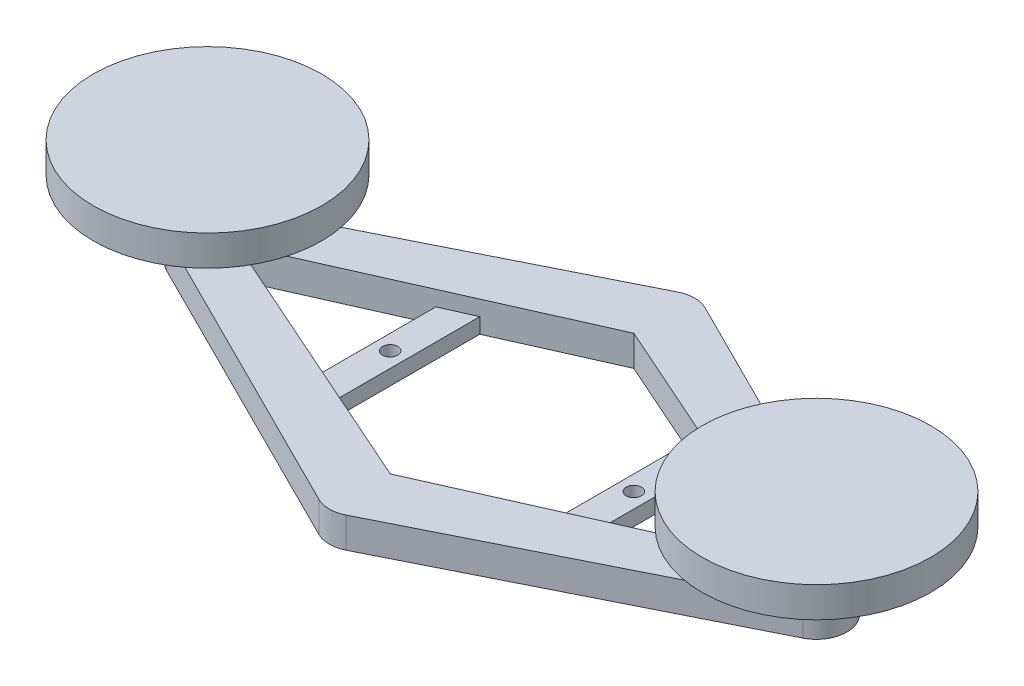
ISO-10303-21;
HEADER;
FILE_DESCRIPTION(('STEP AP214'),'2;1');
FILE_NAME('part.step','',(''),(''),'','','');
FILE_SCHEMA(('AUTOMOTIVE_DESIGN { 1 0 10303 214 1 1 1 1 }'));
ENDSEC;
DATA;
#1=APPLICATION_CONTEXT('core data for automotive mechanical design processes');
#2=APPLICATION_PROTOCOL_DEFINITION('international standard','automotive_design',2000,#1);
#3=PRODUCT_CONTEXT('',#1,'mechanical');
#4=PRODUCT('Part','Part','',(#3));
#5=PRODUCT_RELATED_PRODUCT_CATEGORY('part','',(#4));
#6=PRODUCT_DEFINITION_FORMATION('','',#4);
#7=PRODUCT_DEFINITION_CONTEXT('part definition',#1,'design');
#8=PRODUCT_DEFINITION('design','',#6,#7);
#9=PRODUCT_DEFINITION_SHAPE('','',#8);
#10=(LENGTH_UNIT() NAMED_UNIT(*) SI_UNIT(.MILLI.,.METRE.));
#11=(NAMED_UNIT(*) PLANE_ANGLE_UNIT() SI_UNIT($,.RADIAN.));
#12=(NAMED_UNIT(*) SI_UNIT($,.STERADIAN.) SOLID_ANGLE_UNIT());
#13=UNCERTAINTY_MEASURE_WITH_UNIT(LENGTH_MEASURE(1.E-05),#10,'distance_accuracy_value','');
#14=(GEOMETRIC_REPRESENTATION_CONTEXT(3) GLOBAL_UNCERTAINTY_ASSIGNED_CONTEXT((#13)) GLOBAL_UNIT_ASSIGNED_CONTEXT((#10,
#11,#12)) REPRESENTATION_CONTEXT('',''));
#15=CARTESIAN_POINT('',(0.,0.,0.));
#16=DIRECTION('',(0.,0.,1.));
#17=DIRECTION('',(1.,0.,0.));
#18=AXIS2_PLACEMENT_3D('',#15,#16,#17);
#19=CARTESIAN_POINT('',(45.72,5.08,0.));
#20=DIRECTION('',(-0.406138466053448,0.,-0.913811548620257));
#21=DIRECTION('',(-0.913811548620257,0.,0.406138466053448));
#22=AXIS2_PLACEMENT_3D('',#19,#20,#21);
#23=PLANE('',#22);
#24=DIRECTION('',(0.913811548620257,0.,-0.406138466053448));
#25=VECTOR('',#24,1.);
#26=CARTESIAN_POINT('',(45.72,0.,0.));
#27=LINE('',#26,#25);
#28=CARTESIAN_POINT('',(22.86,0.,10.16));
#29=VERTEX_POINT('',#28);
#30=CARTESIAN_POINT('',(45.72,0.,0.));
#31=VERTEX_POINT('',#30);
#32=EDGE_CURVE('E221',#29,#31,#27,.T.);
#33=ORIENTED_EDGE('',*,*,#32,.F.);
#34=DIRECTION('',(0.,-1.,0.));
#35=VECTOR('',#34,1.);
#36=CARTESIAN_POINT('',(22.86,2.54,10.16));
#37=LINE('',#36,#35);
#38=CARTESIAN_POINT('',(22.86,2.54,10.16));
#39=VERTEX_POINT('',#38);
#40=EDGE_CURVE('E199',#39,#29,#37,.T.);
#41=ORIENTED_EDGE('',*,*,#40,.F.);
#42=DIRECTION('',(0.913811548620257,0.,-0.406138466053447));
#43=VECTOR('',#42,1.);
#44=CARTESIAN_POINT('',(22.86,2.54,10.16));
#45=LINE('',#44,#43);
#46=CARTESIAN_POINT('',(17.78,2.54,12.4177777777778));
#47=VERTEX_POINT('',#46);
#48=EDGE_CURVE('E177',#47,#39,#45,.T.);
#49=ORIENTED_EDGE('',*,*,#48,.F.);
#50=DIRECTION('',(0.,-1.,0.));
#51=VECTOR('',#50,1.);
#52=CARTESIAN_POINT('',(17.78,2.54,12.4177777777778));
#53=LINE('',#52,#51);
#54=CARTESIAN_POINT('',(17.78,0.,12.4177777777778));
#55=VERTEX_POINT('',#54);
#56=EDGE_CURVE('E204',#47,#55,#53,.T.);
#57=ORIENTED_EDGE('',*,*,#56,.T.);
#58=CARTESIAN_POINT('',(0.,0.,20.32));
#59=VERTEX_POINT('',#58);
#60=EDGE_CURVE('E222',#59,#55,#27,.T.);
#61=ORIENTED_EDGE('',*,*,#60,.F.);
#62=DIRECTION('',(0.,-1.,0.));
#63=VECTOR('',#62,1.);
#64=CARTESIAN_POINT('',(0.,5.08,20.32));
#65=LINE('',#64,#63);
#66=CARTESIAN_POINT('',(0.,5.08,20.32));
#67=VERTEX_POINT('',#66);
#68=EDGE_CURVE('E239',#67,#59,#65,.T.);
#69=ORIENTED_EDGE('',*,*,#68,.F.);
#70=DIRECTION('',(0.913811548620257,0.,-0.406138466053448));
#71=VECTOR('',#70,1.);
#72=CARTESIAN_POINT('',(45.72,5.08,0.));
#73=LINE('',#72,#71);
#74=CARTESIAN_POINT('',(45.72,5.08,0.));
#75=VERTEX_POINT('',#74);
#76=EDGE_CURVE('E209',#67,#75,#73,.T.);
#77=ORIENTED_EDGE('',*,*,#76,.T.);
#78=DIRECTION('',(0.,-1.,0.));
#79=VECTOR('',#78,1.);
#80=CARTESIAN_POINT('',(45.72,5.08,0.));
#81=LINE('',#80,#79);
#82=EDGE_CURVE('E236',#75,#31,#81,.T.);
#83=ORIENTED_EDGE('',*,*,#82,.T.);
#84=EDGE_LOOP('',(#33,#41,#49,#57,#61,#69,#77,#83));
#85=FACE_BOUND('',#84,.T.);
#86=ADVANCED_FACE('F33',(#85),#23,.T.);
#87=CARTESIAN_POINT('',(0.,5.08,-20.32));
#88=DIRECTION('',(-0.406138466053448,0.,0.913811548620257));
#89=DIRECTION('',(0.913811548620257,0.,0.406138466053448));
#90=AXIS2_PLACEMENT_3D('',#87,#88,#89);
#91=PLANE('',#90);
#92=DIRECTION('',(-0.913811548620257,0.,-0.406138466053448));
#93=VECTOR('',#92,1.);
#94=CARTESIAN_POINT('',(22.86,2.54,-10.16));
#95=LINE('',#94,#93);
#96=CARTESIAN_POINT('',(22.86,2.54,-10.16));
#97=VERTEX_POINT('',#96);
#98=CARTESIAN_POINT('',(17.78,2.54,-12.4177777777778));
#99=VERTEX_POINT('',#98);
#100=EDGE_CURVE('E174',#97,#99,#95,.T.);
#101=ORIENTED_EDGE('',*,*,#100,.F.);
#102=DIRECTION('',(0.,-1.,0.));
#103=VECTOR('',#102,1.);
#104=CARTESIAN_POINT('',(22.86,2.54,-10.16));
#105=LINE('',#104,#103);
#106=CARTESIAN_POINT('',(22.86,0.,-10.16));
#107=VERTEX_POINT('',#106);
#108=EDGE_CURVE('E182',#97,#107,#105,.T.);
#109=ORIENTED_EDGE('',*,*,#108,.T.);
#110=DIRECTION('',(-0.913811548620257,0.,-0.406138466053448));
#111=VECTOR('',#110,1.);
#112=CARTESIAN_POINT('',(0.,0.,-20.32));
#113=LINE('',#112,#111);
#114=EDGE_CURVE('E226',#31,#107,#113,.T.);
#115=ORIENTED_EDGE('',*,*,#114,.F.);
#116=ORIENTED_EDGE('',*,*,#82,.F.);
#117=DIRECTION('',(-0.913811548620257,0.,-0.406138466053448));
#118=VECTOR('',#117,1.);
#119=CARTESIAN_POINT('',(0.,5.08,-20.32));
#120=LINE('',#119,#118);
#121=CARTESIAN_POINT('',(0.,5.08,-20.32));
#122=VERTEX_POINT('',#121);
#123=EDGE_CURVE('E212',#75,#122,#120,.T.);
#124=ORIENTED_EDGE('',*,*,#123,.T.);
#125=DIRECTION('',(0.,-1.,0.));
#126=VECTOR('',#125,1.);
#127=CARTESIAN_POINT('',(0.,5.08,-20.32));
#128=LINE('',#127,#126);
#129=CARTESIAN_POINT('',(0.,0.,-20.32));
#130=VERTEX_POINT('',#129);
#131=EDGE_CURVE('E233',#122,#130,#128,.T.);
#132=ORIENTED_EDGE('',*,*,#131,.T.);
#133=CARTESIAN_POINT('',(17.78,0.,-12.4177777777778));
#134=VERTEX_POINT('',#133);
#135=EDGE_CURVE('E225',#134,#130,#113,.T.);
#136=ORIENTED_EDGE('',*,*,#135,.F.);
#137=DIRECTION('',(0.,-1.,0.));
#138=VECTOR('',#137,1.);
#139=CARTESIAN_POINT('',(17.78,2.54,-12.4177777777778));
#140=LINE('',#139,#138);
#141=EDGE_CURVE('E190',#99,#134,#140,.T.);
#142=ORIENTED_EDGE('',*,*,#141,.F.);
#143=EDGE_LOOP('',(#101,#109,#115,#116,#124,#132,#136,#142));
#144=FACE_BOUND('',#143,.T.);
#145=ADVANCED_FACE('F192',(#144),#91,.T.);
#146=CARTESIAN_POINT('',(0.,2.54,0.));
#147=DIRECTION('',(0.,-1.,0.));
#148=DIRECTION('',(0.,0.,-1.));
#149=AXIS2_PLACEMENT_3D('',#146,#147,#148);
#150=PLANE('',#149);
#151=DIRECTION('',(-0.913811548620257,0.,0.406138466053448));
#152=VECTOR('',#151,1.);
#153=CARTESIAN_POINT('',(-22.86,2.54,-10.16));
#154=LINE('',#153,#152);
#155=CARTESIAN_POINT('',(-17.78,2.54,-12.4177777777778));
#156=VERTEX_POINT('',#155);
#157=CARTESIAN_POINT('',(-22.86,2.54,-10.16));
#158=VERTEX_POINT('',#157);
#159=EDGE_CURVE('E307',#156,#158,#154,.T.);
#160=ORIENTED_EDGE('',*,*,#159,.T.);
#161=DIRECTION('',(0.,0.,1.));
#162=VECTOR('',#161,1.);
#163=CARTESIAN_POINT('',(-22.86,2.54,-10.16));
#164=LINE('',#163,#162);
#165=CARTESIAN_POINT('',(-22.86,2.54,10.16));
#166=VERTEX_POINT('',#165);
#167=EDGE_CURVE('E310',#158,#166,#164,.T.);
#168=ORIENTED_EDGE('',*,*,#167,.T.);
#169=DIRECTION('',(0.913811548620257,0.,0.406138466053447));
#170=VECTOR('',#169,1.);
#171=CARTESIAN_POINT('',(-22.86,2.54,10.16));
#172=LINE('',#171,#170);
#173=CARTESIAN_POINT('',(-17.78,2.54,12.4177777777778));
#174=VERTEX_POINT('',#173);
#175=EDGE_CURVE('E314',#166,#174,#172,.T.);
#176=ORIENTED_EDGE('',*,*,#175,.T.);
#177=DIRECTION('',(0.,0.,-1.));
#178=VECTOR('',#177,1.);
#179=CARTESIAN_POINT('',(-17.78,2.54,-12.4177777777778));
#180=LINE('',#179,#178);
#181=EDGE_CURVE('E317',#174,#156,#180,.T.);
#182=ORIENTED_EDGE('',*,*,#181,.T.);
#183=EDGE_LOOP('',(#160,#168,#176,#182));
#184=FACE_BOUND('',#183,.T.);
#185=CARTESIAN_POINT('',(-20.32,2.54,0.));
#186=DIRECTION('',(0.,1.,0.));
#187=DIRECTION('',(0.,0.,1.));
#188=AXIS2_PLACEMENT_3D('',#185,#186,#187);
#189=CIRCLE('',#188,1.27);
#190=CARTESIAN_POINT('',(-20.32,2.54,1.27));
#191=VERTEX_POINT('',#190);
#192=EDGE_CURVE('E301',#191,#191,#189,.T.);
#193=ORIENTED_EDGE('',*,*,#192,.F.);
#194=EDGE_LOOP('',(#193));
#195=FACE_BOUND('',#194,.T.);
#196=ADVANCED_FACE('F362',(#184,#195),#150,.F.);
#197=CARTESIAN_POINT('',(0.,0.,0.));
#198=DIRECTION('',(0.,-1.,0.));
#199=DIRECTION('',(0.,0.,-1.));
#200=AXIS2_PLACEMENT_3D('',#197,#198,#199);
#201=PLANE('',#200);
#202=DIRECTION('',(0.,0.,-1.));
#203=VECTOR('',#202,1.);
#204=CARTESIAN_POINT('',(22.86,0.,-10.16));
#205=LINE('',#204,#203);
#206=EDGE_CURVE('E185',#29,#107,#205,.T.);
#207=ORIENTED_EDGE('',*,*,#206,.F.);
#208=ORIENTED_EDGE('',*,*,#32,.T.);
#209=ORIENTED_EDGE('',*,*,#114,.T.);
#210=EDGE_LOOP('',(#207,#208,#209));
#211=FACE_BOUND('',#210,.T.);
#212=DIRECTION('',(0.,0.,1.));
#213=VECTOR('',#212,1.);
#214=CARTESIAN_POINT('',(-22.86,0.,-10.16));
#215=LINE('',#214,#213);
#216=CARTESIAN_POINT('',(-22.86,0.,-10.16));
#217=VERTEX_POINT('',#216);
#218=CARTESIAN_POINT('',(-22.86,0.,10.16));
#219=VERTEX_POINT('',#218);
#220=EDGE_CURVE('E304',#217,#219,#215,.T.);
#221=ORIENTED_EDGE('',*,*,#220,.F.);
#222=DIRECTION('',(-0.913811548620257,0.,0.406138466053448));
#223=VECTOR('',#222,1.);
#224=CARTESIAN_POINT('',(-45.72,0.,0.));
#225=LINE('',#224,#223);
#226=CARTESIAN_POINT('',(-45.72,0.,0.));
#227=VERTEX_POINT('',#226);
#228=EDGE_CURVE('E228',#217,#227,#225,.T.);
#229=ORIENTED_EDGE('',*,*,#228,.T.);
#230=DIRECTION('',(0.913811548620257,0.,0.406138466053448));
#231=VECTOR('',#230,1.);
#232=CARTESIAN_POINT('',(0.,0.,20.32));
#233=LINE('',#232,#231);
#234=EDGE_CURVE('E218',#227,#219,#233,.T.);
#235=ORIENTED_EDGE('',*,*,#234,.T.);
#236=EDGE_LOOP('',(#221,#229,#235));
#237=FACE_BOUND('',#236,.T.);
#238=CARTESIAN_POINT('',(-17.78,0.,-12.4177777777778));
#239=VERTEX_POINT('',#238);
#240=EDGE_CURVE('E210',#130,#239,#225,.T.);
#241=ORIENTED_EDGE('',*,*,#240,.T.);
#242=DIRECTION('',(0.,0.,-1.));
#243=VECTOR('',#242,1.);
#244=CARTESIAN_POINT('',(-17.78,0.,-12.4177777777778));
#245=LINE('',#244,#243);
#246=CARTESIAN_POINT('',(-17.78,0.,12.4177777777778));
#247=VERTEX_POINT('',#246);
#248=EDGE_CURVE('E311',#247,#239,#245,.T.);
#249=ORIENTED_EDGE('',*,*,#248,.F.);
#250=EDGE_CURVE('E189',#247,#59,#233,.T.);
#251=ORIENTED_EDGE('',*,*,#250,.T.);
#252=ORIENTED_EDGE('',*,*,#60,.T.);
#253=DIRECTION('',(0.,0.,1.));
#254=VECTOR('',#253,1.);
#255=CARTESIAN_POINT('',(17.78,0.,-12.4177777777778));
#256=LINE('',#255,#254);
#257=EDGE_CURVE('E49',#134,#55,#256,.T.);
#258=ORIENTED_EDGE('',*,*,#257,.F.);
#259=ORIENTED_EDGE('',*,*,#135,.T.);
#260=EDGE_LOOP('',(#241,#249,#251,#252,#258,#259));
#261=FACE_BOUND('',#260,.T.);
#262=CARTESIAN_POINT('',(-20.32,0.,0.));
#263=DIRECTION('',(0.,1.,0.));
#264=DIRECTION('',(0.,0.,1.));
#265=AXIS2_PLACEMENT_3D('',#262,#263,#264);
#266=CIRCLE('',#265,1.27);
#267=CARTESIAN_POINT('',(-20.32,0.,1.27));
#268=VERTEX_POINT('',#267);
#269=EDGE_CURVE('E300',#268,#268,#266,.T.);
#270=ORIENTED_EDGE('',*,*,#269,.T.);
#271=EDGE_LOOP('',(#270));
#272=FACE_BOUND('',#271,.T.);
#273=CARTESIAN_POINT('',(-50.8,0.,0.));
#274=DIRECTION('',(0.,1.,0.));
#275=DIRECTION('',(0.,0.,1.));
#276=AXIS2_PLACEMENT_3D('',#273,#274,#275);
#277=CIRCLE('',#276,5.08);
#278=CARTESIAN_POINT('',(-53.0718450651398,0.,-4.54369013027957));
#279=VERTEX_POINT('',#278);
#280=CARTESIAN_POINT('',(-53.0718450651398,0.,4.54369013027958));
#281=VERTEX_POINT('',#280);
#282=EDGE_CURVE('E242',#279,#281,#277,.T.);
#283=ORIENTED_EDGE('',*,*,#282,.F.);
#284=DIRECTION('',(-0.894427190999916,0.,0.447213595499958));
#285=VECTOR('',#284,1.);
#286=CARTESIAN_POINT('',(-53.0718450651398,0.,-4.54369013027957));
#287=LINE('',#286,#285);
#288=CARTESIAN_POINT('',(-2.27184506513979,0.,-29.9436901302796));
#289=VERTEX_POINT('',#288);
#290=EDGE_CURVE('E247',#289,#279,#287,.T.);
#291=ORIENTED_EDGE('',*,*,#290,.F.);
#292=CARTESIAN_POINT('',(0.,0.,-25.4));
#293=DIRECTION('',(0.,1.,0.));
#294=DIRECTION('',(0.,0.,1.));
#295=AXIS2_PLACEMENT_3D('',#292,#293,#294);
#296=CIRCLE('',#295,5.08);
#297=CARTESIAN_POINT('',(2.27184506513979,0.,-29.9436901302796));
#298=VERTEX_POINT('',#297);
#299=EDGE_CURVE('E274',#298,#289,#296,.T.);
#300=ORIENTED_EDGE('',*,*,#299,.F.);
#301=DIRECTION('',(-0.894427190999916,0.,-0.447213595499958));
#302=VECTOR('',#301,1.);
#303=CARTESIAN_POINT('',(2.27184506513979,0.,-29.9436901302796));
#304=LINE('',#303,#302);
#305=CARTESIAN_POINT('',(53.0718450651398,0.,-4.54369013027957));
#306=VERTEX_POINT('',#305);
#307=EDGE_CURVE('E272',#306,#298,#304,.T.);
#308=ORIENTED_EDGE('',*,*,#307,.F.);
#309=CARTESIAN_POINT('',(50.8,0.,0.));
#310=DIRECTION('',(0.,1.,0.));
#311=DIRECTION('',(0.,0.,1.));
#312=AXIS2_PLACEMENT_3D('',#309,#310,#311);
#313=CIRCLE('',#312,5.08);
#314=CARTESIAN_POINT('',(53.0718450651398,0.,4.54369013027957));
#315=VERTEX_POINT('',#314);
#316=EDGE_CURVE('E270',#315,#306,#313,.T.);
#317=ORIENTED_EDGE('',*,*,#316,.F.);
#318=DIRECTION('',(0.894427190999916,0.,-0.447213595499958));
#319=VECTOR('',#318,1.);
#320=CARTESIAN_POINT('',(53.0718450651398,0.,4.54369013027957));
#321=LINE('',#320,#319);
#322=CARTESIAN_POINT('',(2.27184506513979,0.,29.9436901302796));
#323=VERTEX_POINT('',#322);
#324=EDGE_CURVE('E268',#323,#315,#321,.T.);
#325=ORIENTED_EDGE('',*,*,#324,.F.);
#326=CARTESIAN_POINT('',(0.,0.,25.4));
#327=DIRECTION('',(0.,1.,0.));
#328=DIRECTION('',(0.,0.,1.));
#329=AXIS2_PLACEMENT_3D('',#326,#327,#328);
#330=CIRCLE('',#329,5.08);
#331=CARTESIAN_POINT('',(-2.27184506513979,0.,29.9436901302796));
#332=VERTEX_POINT('',#331);
#333=EDGE_CURVE('E266',#332,#323,#330,.T.);
#334=ORIENTED_EDGE('',*,*,#333,.F.);
#335=DIRECTION('',(0.894427190999916,0.,0.447213595499958));
#336=VECTOR('',#335,1.);
#337=CARTESIAN_POINT('',(-53.0718450651398,0.,4.54369013027958));
#338=LINE('',#337,#336);
#339=EDGE_CURVE('E264',#281,#332,#338,.T.);
#340=ORIENTED_EDGE('',*,*,#339,.F.);
#341=EDGE_LOOP('',(#283,#291,#300,#308,#317,#325,#334,#340));
#342=FACE_BOUND('',#341,.T.);
#343=CARTESIAN_POINT('',(20.32,0.,0.));
#344=DIRECTION('',(0.,1.,0.));
#345=DIRECTION('',(0.,0.,-1.));
#346=AXIS2_PLACEMENT_3D('',#343,#344,#345);
#347=CIRCLE('',#346,1.27);
#348=CARTESIAN_POINT('',(20.32,0.,-1.27));
#349=VERTEX_POINT('',#348);
#350=EDGE_CURVE('E382',#349,#349,#347,.T.);
#351=ORIENTED_EDGE('',*,*,#350,.T.);
#352=EDGE_LOOP('',(#351));
#353=FACE_BOUND('',#352,.T.);
#354=ADVANCED_FACE('F340',(#211,#237,#261,#272,#342,#353),#201,.T.);
#355=CARTESIAN_POINT('',(-22.86,2.54,-10.16));
#356=DIRECTION('',(1.,0.,0.));
#357=DIRECTION('',(0.,0.,-1.));
#358=AXIS2_PLACEMENT_3D('',#355,#356,#357);
#359=PLANE('',#358);
#360=ORIENTED_EDGE('',*,*,#220,.T.);
#361=DIRECTION('',(0.,-1.,0.));
#362=VECTOR('',#361,1.);
#363=CARTESIAN_POINT('',(-22.86,2.54,10.16));
#364=LINE('',#363,#362);
#365=EDGE_CURVE('E327',#166,#219,#364,.T.);
#366=ORIENTED_EDGE('',*,*,#365,.F.);
#367=ORIENTED_EDGE('',*,*,#167,.F.);
#368=DIRECTION('',(0.,-1.,0.));
#369=VECTOR('',#368,1.);
#370=CARTESIAN_POINT('',(-22.86,2.54,-10.16));
#371=LINE('',#370,#369);
#372=EDGE_CURVE('E37',#158,#217,#371,.T.);
#373=ORIENTED_EDGE('',*,*,#372,.T.);
#374=EDGE_LOOP('',(#360,#366,#367,#373));
#375=FACE_BOUND('',#374,.T.);
#376=ADVANCED_FACE('F35',(#375),#359,.F.);
#377=CARTESIAN_POINT('',(-17.78,2.54,-12.4177777777778));
#378=DIRECTION('',(-1.,0.,0.));
#379=DIRECTION('',(0.,0.,1.));
#380=AXIS2_PLACEMENT_3D('',#377,#378,#379);
#381=PLANE('',#380);
#382=ORIENTED_EDGE('',*,*,#248,.T.);
#383=DIRECTION('',(0.,-1.,0.));
#384=VECTOR('',#383,1.);
#385=CARTESIAN_POINT('',(-17.78,2.54,-12.4177777777778));
#386=LINE('',#385,#384);
#387=EDGE_CURVE('E319',#156,#239,#386,.T.);
#388=ORIENTED_EDGE('',*,*,#387,.F.);
#389=ORIENTED_EDGE('',*,*,#181,.F.);
#390=DIRECTION('',(0.,-1.,0.));
#391=VECTOR('',#390,1.);
#392=CARTESIAN_POINT('',(-17.78,2.54,12.4177777777778));
#393=LINE('',#392,#391);
#394=EDGE_CURVE('E325',#174,#247,#393,.T.);
#395=ORIENTED_EDGE('',*,*,#394,.T.);
#396=EDGE_LOOP('',(#382,#388,#389,#395));
#397=FACE_BOUND('',#396,.T.);
#398=ADVANCED_FACE('F359',(#397),#381,.F.);
#399=CARTESIAN_POINT('',(-20.32,2.54,0.));
#400=DIRECTION('',(0.,-1.,0.));
#401=DIRECTION('',(0.,0.,-1.));
#402=AXIS2_PLACEMENT_3D('',#399,#400,#401);
#403=CYLINDRICAL_SURFACE('',#402,1.27);
#404=ORIENTED_EDGE('',*,*,#192,.T.);
#405=EDGE_LOOP('',(#404));
#406=FACE_BOUND('',#405,.T.);
#407=ORIENTED_EDGE('',*,*,#269,.F.);
#408=EDGE_LOOP('',(#407));
#409=FACE_BOUND('',#408,.T.);
#410=ADVANCED_FACE('F369',(#406,#409),#403,.F.);
#411=CARTESIAN_POINT('',(0.,5.08,20.32));
#412=DIRECTION('',(0.406138466053448,0.,-0.913811548620257));
#413=DIRECTION('',(-0.913811548620257,0.,-0.406138466053448));
#414=AXIS2_PLACEMENT_3D('',#411,#412,#413);
#415=PLANE('',#414);
#416=ORIENTED_EDGE('',*,*,#365,.T.);
#417=ORIENTED_EDGE('',*,*,#234,.F.);
#418=DIRECTION('',(0.,-1.,0.));
#419=VECTOR('',#418,1.);
#420=CARTESIAN_POINT('',(-45.72,5.08,0.));
#421=LINE('',#420,#419);
#422=CARTESIAN_POINT('',(-45.72,5.08,0.));
#423=VERTEX_POINT('',#422);
#424=EDGE_CURVE('E217',#423,#227,#421,.T.);
#425=ORIENTED_EDGE('',*,*,#424,.F.);
#426=DIRECTION('',(0.913811548620257,0.,0.406138466053448));
#427=VECTOR('',#426,1.);
#428=CARTESIAN_POINT('',(0.,5.08,20.32));
#429=LINE('',#428,#427);
#430=EDGE_CURVE('E207',#423,#67,#429,.T.);
#431=ORIENTED_EDGE('',*,*,#430,.T.);
#432=ORIENTED_EDGE('',*,*,#68,.T.);
#433=ORIENTED_EDGE('',*,*,#250,.F.);
#434=ORIENTED_EDGE('',*,*,#394,.F.);
#435=ORIENTED_EDGE('',*,*,#175,.F.);
#436=EDGE_LOOP('',(#416,#417,#425,#431,#432,#433,#434,#435));
#437=FACE_BOUND('',#436,.T.);
#438=ADVANCED_FACE('F342',(#437),#415,.T.);
#439=CARTESIAN_POINT('',(-45.72,5.08,0.));
#440=DIRECTION('',(0.406138466053448,0.,0.913811548620257));
#441=DIRECTION('',(0.913811548620257,0.,-0.406138466053448));
#442=AXIS2_PLACEMENT_3D('',#439,#440,#441);
#443=PLANE('',#442);
#444=ORIENTED_EDGE('',*,*,#372,.F.);
#445=ORIENTED_EDGE('',*,*,#159,.F.);
#446=ORIENTED_EDGE('',*,*,#387,.T.);
#447=ORIENTED_EDGE('',*,*,#240,.F.);
#448=ORIENTED_EDGE('',*,*,#131,.F.);
#449=DIRECTION('',(-0.913811548620257,0.,0.406138466053448));
#450=VECTOR('',#449,1.);
#451=CARTESIAN_POINT('',(-45.72,5.08,0.));
#452=LINE('',#451,#450);
#453=EDGE_CURVE('E215',#122,#423,#452,.T.);
#454=ORIENTED_EDGE('',*,*,#453,.T.);
#455=ORIENTED_EDGE('',*,*,#424,.T.);
#456=ORIENTED_EDGE('',*,*,#228,.F.);
#457=EDGE_LOOP('',(#444,#445,#446,#447,#448,#454,#455,#456));
#458=FACE_BOUND('',#457,.T.);
#459=ADVANCED_FACE('F337',(#458),#443,.T.);
#460=CARTESIAN_POINT('',(-50.8,5.08,0.));
#461=DIRECTION('',(0.,1.,0.));
#462=DIRECTION('',(0.,0.,1.));
#463=AXIS2_PLACEMENT_3D('',#460,#461,#462);
#464=PLANE('',#463);
#465=CARTESIAN_POINT('',(50.8,5.08,0.));
#466=DIRECTION('',(0.,1.,0.));
#467=DIRECTION('',(0.,0.,1.));
#468=AXIS2_PLACEMENT_3D('',#465,#466,#467);
#469=CIRCLE('',#468,3.17500000000001);
#470=CARTESIAN_POINT('',(50.8,5.08,-3.17500000000001));
#471=VERTEX_POINT('',#470);
#472=EDGE_CURVE('E391',#471,#471,#469,.T.);
#473=ORIENTED_EDGE('',*,*,#472,.F.);
#474=EDGE_LOOP('',(#473));
#475=FACE_BOUND('',#474,.T.);
#476=CARTESIAN_POINT('',(-50.8,5.08,0.));
#477=DIRECTION('',(0.,1.,0.));
#478=DIRECTION('',(0.,0.,1.));
#479=AXIS2_PLACEMENT_3D('',#476,#477,#478);
#480=CIRCLE('',#479,3.175);
#481=CARTESIAN_POINT('',(-50.8,5.08,-3.175));
#482=VERTEX_POINT('',#481);
#483=EDGE_CURVE('E11',#482,#482,#480,.T.);
#484=ORIENTED_EDGE('',*,*,#483,.F.);
#485=EDGE_LOOP('',(#484));
#486=FACE_BOUND('',#485,.T.);
#487=CARTESIAN_POINT('',(-50.8,5.08,0.));
#488=DIRECTION('',(0.,1.,0.));
#489=DIRECTION('',(0.,0.,1.));
#490=AXIS2_PLACEMENT_3D('',#487,#488,#489);
#491=CIRCLE('',#490,5.08);
#492=CARTESIAN_POINT('',(-53.0718450651398,5.08,-4.54369013027957));
#493=VERTEX_POINT('',#492);
#494=CARTESIAN_POINT('',(-53.0718450651398,5.08,4.54369013027958));
#495=VERTEX_POINT('',#494);
#496=EDGE_CURVE('E243',#493,#495,#491,.T.);
#497=ORIENTED_EDGE('',*,*,#496,.T.);
#498=DIRECTION('',(0.894427190999916,0.,0.447213595499958));
#499=VECTOR('',#498,1.);
#500=CARTESIAN_POINT('',(-53.0718450651398,5.08,4.54369013027958));
#501=LINE('',#500,#499);
#502=CARTESIAN_POINT('',(-2.27184506513979,5.08,29.9436901302796));
#503=VERTEX_POINT('',#502);
#504=EDGE_CURVE('E246',#495,#503,#501,.T.);
#505=ORIENTED_EDGE('',*,*,#504,.T.);
#506=CARTESIAN_POINT('',(0.,5.08,25.4));
#507=DIRECTION('',(0.,1.,0.));
#508=DIRECTION('',(0.,0.,1.));
#509=AXIS2_PLACEMENT_3D('',#506,#507,#508);
#510=CIRCLE('',#509,5.08);
#511=CARTESIAN_POINT('',(2.27184506513979,5.08,29.9436901302796));
#512=VERTEX_POINT('',#511);
#513=EDGE_CURVE('E249',#503,#512,#510,.T.);
#514=ORIENTED_EDGE('',*,*,#513,.T.);
#515=DIRECTION('',(0.894427190999916,0.,-0.447213595499958));
#516=VECTOR('',#515,1.);
#517=CARTESIAN_POINT('',(53.0718450651398,5.08,4.54369013027957));
#518=LINE('',#517,#516);
#519=CARTESIAN_POINT('',(53.0718450651398,5.08,4.54369013027957));
#520=VERTEX_POINT('',#519);
#521=EDGE_CURVE('E251',#512,#520,#518,.T.);
#522=ORIENTED_EDGE('',*,*,#521,.T.);
#523=CARTESIAN_POINT('',(50.8,5.08,0.));
#524=DIRECTION('',(0.,1.,0.));
#525=DIRECTION('',(0.,0.,1.));
#526=AXIS2_PLACEMENT_3D('',#523,#524,#525);
#527=CIRCLE('',#526,5.08);
#528=CARTESIAN_POINT('',(53.0718450651398,5.08,-4.54369013027957));
#529=VERTEX_POINT('',#528);
#530=EDGE_CURVE('E253',#520,#529,#527,.T.);
#531=ORIENTED_EDGE('',*,*,#530,.T.);
#532=DIRECTION('',(-0.894427190999916,0.,-0.447213595499958));
#533=VECTOR('',#532,1.);
#534=CARTESIAN_POINT('',(2.27184506513979,5.08,-29.9436901302796));
#535=LINE('',#534,#533);
#536=CARTESIAN_POINT('',(2.27184506513979,5.08,-29.9436901302796));
#537=VERTEX_POINT('',#536);
#538=EDGE_CURVE('E255',#529,#537,#535,.T.);
#539=ORIENTED_EDGE('',*,*,#538,.T.);
#540=CARTESIAN_POINT('',(0.,5.08,-25.4));
#541=DIRECTION('',(0.,1.,0.));
#542=DIRECTION('',(0.,0.,1.));
#543=AXIS2_PLACEMENT_3D('',#540,#541,#542);
#544=CIRCLE('',#543,5.08);
#545=CARTESIAN_POINT('',(-2.27184506513979,5.08,-29.9436901302796));
#546=VERTEX_POINT('',#545);
#547=EDGE_CURVE('E257',#537,#546,#544,.T.);
#548=ORIENTED_EDGE('',*,*,#547,.T.);
#549=DIRECTION('',(-0.894427190999916,0.,0.447213595499958));
#550=VECTOR('',#549,1.);
#551=CARTESIAN_POINT('',(-53.0718450651398,5.08,-4.54369013027957));
#552=LINE('',#551,#550);
#553=EDGE_CURVE('E259',#546,#493,#552,.T.);
#554=ORIENTED_EDGE('',*,*,#553,.T.);
#555=EDGE_LOOP('',(#497,#505,#514,#522,#531,#539,#548,#554));
#556=FACE_BOUND('',#555,.T.);
#557=ORIENTED_EDGE('',*,*,#76,.F.);
#558=ORIENTED_EDGE('',*,*,#430,.F.);
#559=ORIENTED_EDGE('',*,*,#453,.F.);
#560=ORIENTED_EDGE('',*,*,#123,.F.);
#561=EDGE_LOOP('',(#557,#558,#559,#560));
#562=FACE_BOUND('',#561,.T.);
#563=ADVANCED_FACE('F348',(#475,#486,#556,#562),#464,.T.);
#564=CARTESIAN_POINT('',(-50.8,5.08,0.));
#565=DIRECTION('',(0.,-1.,0.));
#566=DIRECTION('',(0.,0.,-1.));
#567=AXIS2_PLACEMENT_3D('',#564,#565,#566);
#568=CYLINDRICAL_SURFACE('',#567,5.08);
#569=ORIENTED_EDGE('',*,*,#282,.T.);
#570=DIRECTION('',(0.,-1.,0.));
#571=VECTOR('',#570,1.);
#572=CARTESIAN_POINT('',(-53.0718450651398,5.08,4.54369013027958));
#573=LINE('',#572,#571);
#574=EDGE_CURVE('E297',#495,#281,#573,.T.);
#575=ORIENTED_EDGE('',*,*,#574,.F.);
#576=ORIENTED_EDGE('',*,*,#496,.F.);
#577=DIRECTION('',(0.,-1.,0.));
#578=VECTOR('',#577,1.);
#579=CARTESIAN_POINT('',(-53.0718450651398,5.08,-4.54369013027957));
#580=LINE('',#579,#578);
#581=EDGE_CURVE('E261',#493,#279,#580,.T.);
#582=ORIENTED_EDGE('',*,*,#581,.T.);
#583=EDGE_LOOP('',(#569,#575,#576,#582));
#584=FACE_BOUND('',#583,.T.);
#585=ADVANCED_FACE('F438',(#584),#568,.T.);
#586=CARTESIAN_POINT('',(-53.0718450651398,5.08,4.54369013027958));
#587=DIRECTION('',(0.447213595499958,0.,-0.894427190999916));
#588=DIRECTION('',(-0.894427190999916,0.,-0.447213595499958));
#589=AXIS2_PLACEMENT_3D('',#586,#587,#588);
#590=PLANE('',#589);
#591=ORIENTED_EDGE('',*,*,#339,.T.);
#592=DIRECTION('',(0.,-1.,0.));
#593=VECTOR('',#592,1.);
#594=CARTESIAN_POINT('',(-2.27184506513979,5.08,29.9436901302796));
#595=LINE('',#594,#593);
#596=EDGE_CURVE('E294',#503,#332,#595,.T.);
#597=ORIENTED_EDGE('',*,*,#596,.F.);
#598=ORIENTED_EDGE('',*,*,#504,.F.);
#599=ORIENTED_EDGE('',*,*,#574,.T.);
#600=EDGE_LOOP('',(#591,#597,#598,#599));
#601=FACE_BOUND('',#600,.T.);
#602=ADVANCED_FACE('F463',(#601),#590,.F.);
#603=CARTESIAN_POINT('',(0.,5.08,25.4));
#604=DIRECTION('',(0.,-1.,0.));
#605=DIRECTION('',(0.,0.,-1.));
#606=AXIS2_PLACEMENT_3D('',#603,#604,#605);
#607=CYLINDRICAL_SURFACE('',#606,5.08);
#608=ORIENTED_EDGE('',*,*,#333,.T.);
#609=DIRECTION('',(0.,-1.,0.));
#610=VECTOR('',#609,1.);
#611=CARTESIAN_POINT('',(2.27184506513979,5.08,29.9436901302796));
#612=LINE('',#611,#610);
#613=EDGE_CURVE('E291',#512,#323,#612,.T.);
#614=ORIENTED_EDGE('',*,*,#613,.F.);
#615=ORIENTED_EDGE('',*,*,#513,.F.);
#616=ORIENTED_EDGE('',*,*,#596,.T.);
#617=EDGE_LOOP('',(#608,#614,#615,#616));
#618=FACE_BOUND('',#617,.T.);
#619=ADVANCED_FACE('F459',(#618),#607,.T.);
#620=CARTESIAN_POINT('',(53.0718450651398,5.08,4.54369013027957));
#621=DIRECTION('',(-0.447213595499958,0.,-0.894427190999916));
#622=DIRECTION('',(-0.894427190999916,0.,0.447213595499958));
#623=AXIS2_PLACEMENT_3D('',#620,#621,#622);
#624=PLANE('',#623);
#625=ORIENTED_EDGE('',*,*,#324,.T.);
#626=DIRECTION('',(0.,-1.,0.));
#627=VECTOR('',#626,1.);
#628=CARTESIAN_POINT('',(53.0718450651398,5.08,4.54369013027957));
#629=LINE('',#628,#627);
#630=EDGE_CURVE('E288',#520,#315,#629,.T.);
#631=ORIENTED_EDGE('',*,*,#630,.F.);
#632=ORIENTED_EDGE('',*,*,#521,.F.);
#633=ORIENTED_EDGE('',*,*,#613,.T.);
#634=EDGE_LOOP('',(#625,#631,#632,#633));
#635=FACE_BOUND('',#634,.T.);
#636=ADVANCED_FACE('F455',(#635),#624,.F.);
#637=CARTESIAN_POINT('',(50.8,5.08,0.));
#638=DIRECTION('',(0.,-1.,0.));
#639=DIRECTION('',(0.,0.,-1.));
#640=AXIS2_PLACEMENT_3D('',#637,#638,#639);
#641=CYLINDRICAL_SURFACE('',#640,5.08);
#642=ORIENTED_EDGE('',*,*,#316,.T.);
#643=DIRECTION('',(0.,-1.,0.));
#644=VECTOR('',#643,1.);
#645=CARTESIAN_POINT('',(53.0718450651398,5.08,-4.54369013027957));
#646=LINE('',#645,#644);
#647=EDGE_CURVE('E285',#529,#306,#646,.T.);
#648=ORIENTED_EDGE('',*,*,#647,.F.);
#649=ORIENTED_EDGE('',*,*,#530,.F.);
#650=ORIENTED_EDGE('',*,*,#630,.T.);
#651=EDGE_LOOP('',(#642,#648,#649,#650));
#652=FACE_BOUND('',#651,.T.);
#653=ADVANCED_FACE('F451',(#652),#641,.T.);
#654=CARTESIAN_POINT('',(2.27184506513979,5.08,-29.9436901302796));
#655=DIRECTION('',(-0.447213595499958,0.,0.894427190999916));
#656=DIRECTION('',(0.894427190999916,0.,0.447213595499958));
#657=AXIS2_PLACEMENT_3D('',#654,#655,#656);
#658=PLANE('',#657);
#659=ORIENTED_EDGE('',*,*,#307,.T.);
#660=DIRECTION('',(0.,-1.,0.));
#661=VECTOR('',#660,1.);
#662=CARTESIAN_POINT('',(2.27184506513979,5.08,-29.9436901302796));
#663=LINE('',#662,#661);
#664=EDGE_CURVE('E282',#537,#298,#663,.T.);
#665=ORIENTED_EDGE('',*,*,#664,.F.);
#666=ORIENTED_EDGE('',*,*,#538,.F.);
#667=ORIENTED_EDGE('',*,*,#647,.T.);
#668=EDGE_LOOP('',(#659,#665,#666,#667));
#669=FACE_BOUND('',#668,.T.);
#670=ADVANCED_FACE('F447',(#669),#658,.F.);
#671=CARTESIAN_POINT('',(0.,5.08,-25.4));
#672=DIRECTION('',(0.,-1.,0.));
#673=DIRECTION('',(0.,0.,-1.));
#674=AXIS2_PLACEMENT_3D('',#671,#672,#673);
#675=CYLINDRICAL_SURFACE('',#674,5.08);
#676=ORIENTED_EDGE('',*,*,#299,.T.);
#677=DIRECTION('',(0.,-1.,0.));
#678=VECTOR('',#677,1.);
#679=CARTESIAN_POINT('',(-2.27184506513979,5.08,-29.9436901302796));
#680=LINE('',#679,#678);
#681=EDGE_CURVE('E279',#546,#289,#680,.T.);
#682=ORIENTED_EDGE('',*,*,#681,.F.);
#683=ORIENTED_EDGE('',*,*,#547,.F.);
#684=ORIENTED_EDGE('',*,*,#664,.T.);
#685=EDGE_LOOP('',(#676,#682,#683,#684));
#686=FACE_BOUND('',#685,.T.);
#687=ADVANCED_FACE('F443',(#686),#675,.T.);
#688=CARTESIAN_POINT('',(-53.0718450651398,5.08,-4.54369013027957));
#689=DIRECTION('',(0.447213595499958,0.,0.894427190999916));
#690=DIRECTION('',(0.894427190999916,0.,-0.447213595499958));
#691=AXIS2_PLACEMENT_3D('',#688,#689,#690);
#692=PLANE('',#691);
#693=ORIENTED_EDGE('',*,*,#290,.T.);
#694=ORIENTED_EDGE('',*,*,#581,.F.);
#695=ORIENTED_EDGE('',*,*,#553,.F.);
#696=ORIENTED_EDGE('',*,*,#681,.T.);
#697=EDGE_LOOP('',(#693,#694,#695,#696));
#698=FACE_BOUND('',#697,.T.);
#699=ADVANCED_FACE('F440',(#698),#692,.F.);
#700=CARTESIAN_POINT('',(0.,2.54,0.));
#701=DIRECTION('',(0.,-1.,0.));
#702=DIRECTION('',(0.,0.,-1.));
#703=AXIS2_PLACEMENT_3D('',#700,#701,#702);
#704=PLANE('',#703);
#705=DIRECTION('',(0.,0.,-1.));
#706=VECTOR('',#705,1.);
#707=CARTESIAN_POINT('',(22.86,2.54,-10.16));
#708=LINE('',#707,#706);
#709=EDGE_CURVE('E169',#39,#97,#708,.T.);
#710=ORIENTED_EDGE('',*,*,#709,.T.);
#711=ORIENTED_EDGE('',*,*,#100,.T.);
#712=DIRECTION('',(0.,0.,1.));
#713=VECTOR('',#712,1.);
#714=CARTESIAN_POINT('',(17.78,2.54,-12.4177777777778));
#715=LINE('',#714,#713);
#716=EDGE_CURVE('E54',#99,#47,#715,.T.);
#717=ORIENTED_EDGE('',*,*,#716,.T.);
#718=ORIENTED_EDGE('',*,*,#48,.T.);
#719=EDGE_LOOP('',(#710,#711,#717,#718));
#720=FACE_BOUND('',#719,.T.);
#721=CARTESIAN_POINT('',(20.32,2.54,0.));
#722=DIRECTION('',(0.,1.,0.));
#723=DIRECTION('',(0.,0.,-1.));
#724=AXIS2_PLACEMENT_3D('',#721,#722,#723);
#725=CIRCLE('',#724,1.27);
#726=CARTESIAN_POINT('',(20.32,2.54,-1.27));
#727=VERTEX_POINT('',#726);
#728=EDGE_CURVE('E201',#727,#727,#725,.T.);
#729=ORIENTED_EDGE('',*,*,#728,.F.);
#730=EDGE_LOOP('',(#729));
#731=FACE_BOUND('',#730,.T.);
#732=ADVANCED_FACE('F171',(#720,#731),#704,.F.);
#733=CARTESIAN_POINT('',(22.86,2.54,-10.16));
#734=DIRECTION('',(-1.,0.,0.));
#735=DIRECTION('',(0.,0.,1.));
#736=AXIS2_PLACEMENT_3D('',#733,#734,#735);
#737=PLANE('',#736);
#738=ORIENTED_EDGE('',*,*,#206,.T.);
#739=ORIENTED_EDGE('',*,*,#108,.F.);
#740=ORIENTED_EDGE('',*,*,#709,.F.);
#741=ORIENTED_EDGE('',*,*,#40,.T.);
#742=EDGE_LOOP('',(#738,#739,#740,#741));
#743=FACE_BOUND('',#742,.T.);
#744=ADVANCED_FACE('F183',(#743),#737,.F.);
#745=CARTESIAN_POINT('',(17.78,2.54,-12.4177777777778));
#746=DIRECTION('',(1.,0.,0.));
#747=DIRECTION('',(0.,0.,-1.));
#748=AXIS2_PLACEMENT_3D('',#745,#746,#747);
#749=PLANE('',#748);
#750=ORIENTED_EDGE('',*,*,#257,.T.);
#751=ORIENTED_EDGE('',*,*,#56,.F.);
#752=ORIENTED_EDGE('',*,*,#716,.F.);
#753=ORIENTED_EDGE('',*,*,#141,.T.);
#754=EDGE_LOOP('',(#750,#751,#752,#753));
#755=FACE_BOUND('',#754,.T.);
#756=ADVANCED_FACE('F561',(#755),#749,.F.);
#757=CARTESIAN_POINT('',(20.32,2.54,0.));
#758=DIRECTION('',(0.,-1.,0.));
#759=DIRECTION('',(0.,0.,-1.));
#760=AXIS2_PLACEMENT_3D('',#757,#758,#759);
#761=CYLINDRICAL_SURFACE('',#760,1.27);
#762=ORIENTED_EDGE('',*,*,#728,.T.);
#763=EDGE_LOOP('',(#762));
#764=FACE_BOUND('',#763,.T.);
#765=ORIENTED_EDGE('',*,*,#350,.F.);
#766=EDGE_LOOP('',(#765));
#767=FACE_BOUND('',#766,.T.);
#768=ADVANCED_FACE('F568',(#764,#767),#761,.F.);
#769=CARTESIAN_POINT('',(-50.8,12.7,0.));
#770=DIRECTION('',(0.,-1.,0.));
#771=DIRECTION('',(0.,0.,-1.));
#772=AXIS2_PLACEMENT_3D('',#769,#770,#771);
#773=CYLINDRICAL_SURFACE('',#772,3.175);
#774=CARTESIAN_POINT('',(-50.8,12.7,0.));
#775=DIRECTION('',(0.,1.,0.));
#776=DIRECTION('',(0.,0.,1.));
#777=AXIS2_PLACEMENT_3D('',#774,#775,#776);
#778=CIRCLE('',#777,3.175);
#779=CARTESIAN_POINT('',(-50.8,12.7,-3.175));
#780=VERTEX_POINT('',#779);
#781=EDGE_CURVE('E384',#780,#780,#778,.T.);
#782=CARTESIAN_POINT('',(-50.8,12.7,-3.175));
#783=CARTESIAN_POINT('',(-50.8,12.620625,-3.175));
#784=CARTESIAN_POINT('',(-50.8,12.54125,-3.175));
#785=CARTESIAN_POINT('',(-50.8,12.3825,-3.175));
#786=CARTESIAN_POINT('',(-50.8,12.303125,-3.175));
#787=CARTESIAN_POINT('',(-50.8,12.144375,-3.175));
#788=CARTESIAN_POINT('',(-50.8,12.065,-3.175));
#789=CARTESIAN_POINT('',(-50.8,11.90625,-3.175));
#790=CARTESIAN_POINT('',(-50.8,11.826875,-3.175));
#791=CARTESIAN_POINT('',(-50.8,11.668125,-3.175));
#792=CARTESIAN_POINT('',(-50.8,11.58875,-3.175));
#793=CARTESIAN_POINT('',(-50.8,11.43,-3.175));
#794=CARTESIAN_POINT('',(-50.8,11.350625,-3.175));
#795=CARTESIAN_POINT('',(-50.8,11.191875,-3.175));
#796=CARTESIAN_POINT('',(-50.8,11.1125,-3.175));
#797=CARTESIAN_POINT('',(-50.8,10.95375,-3.175));
#798=CARTESIAN_POINT('',(-50.8,10.874375,-3.175));
#799=CARTESIAN_POINT('',(-50.8,10.715625,-3.175));
#800=CARTESIAN_POINT('',(-50.8,10.63625,-3.175));
#801=CARTESIAN_POINT('',(-50.8,10.4775,-3.175));
#802=CARTESIAN_POINT('',(-50.8,10.398125,-3.175));
#803=CARTESIAN_POINT('',(-50.8,10.239375,-3.175));
#804=CARTESIAN_POINT('',(-50.8,10.16,-3.175));
#805=CARTESIAN_POINT('',(-50.8,10.00125,-3.175));
#806=CARTESIAN_POINT('',(-50.8,9.921875,-3.175));
#807=CARTESIAN_POINT('',(-50.8,9.763125,-3.175));
#808=CARTESIAN_POINT('',(-50.8,9.68375,-3.175));
#809=CARTESIAN_POINT('',(-50.8,9.525,-3.175));
#810=CARTESIAN_POINT('',(-50.8,9.445625,-3.175));
#811=CARTESIAN_POINT('',(-50.8,9.286875,-3.175));
#812=CARTESIAN_POINT('',(-50.8,9.2075,-3.175));
#813=CARTESIAN_POINT('',(-50.8,9.04875,-3.175));
#814=CARTESIAN_POINT('',(-50.8,8.969375,-3.175));
#815=CARTESIAN_POINT('',(-50.8,8.810625,-3.175));
#816=CARTESIAN_POINT('',(-50.8,8.73125,-3.175));
#817=CARTESIAN_POINT('',(-50.8,8.5725,-3.175));
#818=CARTESIAN_POINT('',(-50.8,8.493125,-3.175));
#819=CARTESIAN_POINT('',(-50.8,8.334375,-3.175));
#820=CARTESIAN_POINT('',(-50.8,8.255,-3.175));
#821=CARTESIAN_POINT('',(-50.8,8.09625,-3.175));
#822=CARTESIAN_POINT('',(-50.8,8.016875,-3.175));
#823=CARTESIAN_POINT('',(-50.8,7.858125,-3.175));
#824=CARTESIAN_POINT('',(-50.8,7.77875,-3.175));
#825=CARTESIAN_POINT('',(-50.8,7.62,-3.175));
#826=CARTESIAN_POINT('',(-50.8,7.540625,-3.175));
#827=CARTESIAN_POINT('',(-50.8,7.381875,-3.175));
#828=CARTESIAN_POINT('',(-50.8,7.3025,-3.175));
#829=CARTESIAN_POINT('',(-50.8,7.14375,-3.175));
#830=CARTESIAN_POINT('',(-50.8,7.064375,-3.175));
#831=CARTESIAN_POINT('',(-50.8,6.905625,-3.175));
#832=CARTESIAN_POINT('',(-50.8,6.82625,-3.175));
#833=CARTESIAN_POINT('',(-50.8,6.6675,-3.175));
#834=CARTESIAN_POINT('',(-50.8,6.588125,-3.175));
#835=CARTESIAN_POINT('',(-50.8,6.429375,-3.175));
#836=CARTESIAN_POINT('',(-50.8,6.35,-3.175));
#837=CARTESIAN_POINT('',(-50.8,6.19125,-3.175));
#838=CARTESIAN_POINT('',(-50.8,6.111875,-3.175));
#839=CARTESIAN_POINT('',(-50.8,5.953125,-3.175));
#840=CARTESIAN_POINT('',(-50.8,5.87375,-3.175));
#841=CARTESIAN_POINT('',(-50.8,5.715,-3.175));
#842=CARTESIAN_POINT('',(-50.8,5.635625,-3.175));
#843=CARTESIAN_POINT('',(-50.8,5.476875,-3.175));
#844=CARTESIAN_POINT('',(-50.8,5.3975,-3.175));
#845=CARTESIAN_POINT('',(-50.8,5.23875,-3.175));
#846=CARTESIAN_POINT('',(-50.8,5.159375,-3.175));
#847=CARTESIAN_POINT('',(-50.8,5.08,-3.175));
#848=B_SPLINE_CURVE_WITH_KNOTS('',3,(#782,#783,#784,#785,#786,#787,#788,#789,#790,#791,#792,
#793,#794,#795,#796,#797,#798,#799,#800,#801,#802,#803,#804,#805,#806,#807,#808,#809,#810,#811,
#812,#813,#814,#815,#816,#817,#818,#819,#820,#821,#822,#823,#824,#825,#826,#827,#828,#829,#830,
#831,#832,#833,#834,#835,#836,#837,#838,#839,#840,#841,#842,#843,#844,#845,#846,#847),
.UNSPECIFIED.,.F.,.F.,(4,2,2,2,2,2,2,2,2,2,2,2,2,2,2,2,2,2,2,2,2,2,2,2,2,2,2,2,2,2,2,2,4),(0.,
0.238125,0.476250000000001,0.714375000000001,0.9525,1.190625,1.42875,1.666875,1.905,2.143125,
2.38125,2.619375,2.8575,3.095625,3.33375,3.571875,3.81,4.048125,4.28625,4.524375,4.7625,
5.000625,5.23875,5.476875,5.715,5.953125,6.19125,6.429375,6.6675,6.905625,7.14375,7.381875,
7.62),.UNSPECIFIED.);
#849=EDGE_CURVE('BSEAM574',#780,#482,#848,.T.);
#850=ORIENTED_EDGE('',*,*,#781,.F.);
#851=ORIENTED_EDGE('',*,*,#483,.T.);
#852=ORIENTED_EDGE('',*,*,#849,.T.);
#853=ORIENTED_EDGE('',*,*,#849,.F.);
#854=EDGE_LOOP('',(#850,#852,#851,#853));
#855=FACE_BOUND('',#854,.T.);
#856=ADVANCED_FACE('F574',(#855),#773,.T.);
#857=CARTESIAN_POINT('',(50.8,12.7,0.));
#858=DIRECTION('',(0.,-1.,0.));
#859=DIRECTION('',(0.,0.,-1.));
#860=AXIS2_PLACEMENT_3D('',#857,#858,#859);
#861=CYLINDRICAL_SURFACE('',#860,3.17500000000001);
#862=CARTESIAN_POINT('',(50.8,12.7,0.));
#863=DIRECTION('',(0.,1.,0.));
#864=DIRECTION('',(0.,0.,1.));
#865=AXIS2_PLACEMENT_3D('',#862,#863,#864);
#866=CIRCLE('',#865,3.17500000000001);
#867=CARTESIAN_POINT('',(50.8,12.7,-3.17500000000001));
#868=VERTEX_POINT('',#867);
#869=EDGE_CURVE('E388',#868,#868,#866,.T.);
#870=CARTESIAN_POINT('',(50.8,12.7,-3.17500000000001));
#871=CARTESIAN_POINT('',(50.8,12.620625,-3.17500000000001));
#872=CARTESIAN_POINT('',(50.8,12.54125,-3.17500000000001));
#873=CARTESIAN_POINT('',(50.8,12.3825,-3.17500000000001));
#874=CARTESIAN_POINT('',(50.8,12.303125,-3.17500000000001));
#875=CARTESIAN_POINT('',(50.8,12.144375,-3.17500000000001));
#876=CARTESIAN_POINT('',(50.8,12.065,-3.17500000000001));
#877=CARTESIAN_POINT('',(50.8,11.90625,-3.17500000000001));
#878=CARTESIAN_POINT('',(50.8,11.826875,-3.17500000000001));
#879=CARTESIAN_POINT('',(50.8,11.668125,-3.17500000000001));
#880=CARTESIAN_POINT('',(50.8,11.58875,-3.17500000000001));
#881=CARTESIAN_POINT('',(50.8,11.43,-3.17500000000001));
#882=CARTESIAN_POINT('',(50.8,11.350625,-3.17500000000001));
#883=CARTESIAN_POINT('',(50.8,11.191875,-3.17500000000001));
#884=CARTESIAN_POINT('',(50.8,11.1125,-3.17500000000001));
#885=CARTESIAN_POINT('',(50.8,10.95375,-3.17500000000001));
#886=CARTESIAN_POINT('',(50.8,10.874375,-3.17500000000001));
#887=CARTESIAN_POINT('',(50.8,10.715625,-3.17500000000001));
#888=CARTESIAN_POINT('',(50.8,10.63625,-3.17500000000001));
#889=CARTESIAN_POINT('',(50.8,10.4775,-3.17500000000001));
#890=CARTESIAN_POINT('',(50.8,10.398125,-3.17500000000001));
#891=CARTESIAN_POINT('',(50.8,10.239375,-3.17500000000001));
#892=CARTESIAN_POINT('',(50.8,10.16,-3.17500000000001));
#893=CARTESIAN_POINT('',(50.8,10.00125,-3.17500000000001));
#894=CARTESIAN_POINT('',(50.8,9.921875,-3.17500000000001));
#895=CARTESIAN_POINT('',(50.8,9.763125,-3.17500000000001));
#896=CARTESIAN_POINT('',(50.8,9.68375,-3.17500000000001));
#897=CARTESIAN_POINT('',(50.8,9.525,-3.17500000000001));
#898=CARTESIAN_POINT('',(50.8,9.445625,-3.17500000000001));
#899=CARTESIAN_POINT('',(50.8,9.286875,-3.17500000000001));
#900=CARTESIAN_POINT('',(50.8,9.2075,-3.17500000000001));
#901=CARTESIAN_POINT('',(50.8,9.04875,-3.17500000000001));
#902=CARTESIAN_POINT('',(50.8,8.969375,-3.17500000000001));
#903=CARTESIAN_POINT('',(50.8,8.810625,-3.17500000000001));
#904=CARTESIAN_POINT('',(50.8,8.73125,-3.17500000000001));
#905=CARTESIAN_POINT('',(50.8,8.5725,-3.17500000000001));
#906=CARTESIAN_POINT('',(50.8,8.493125,-3.17500000000001));
#907=CARTESIAN_POINT('',(50.8,8.334375,-3.17500000000001));
#908=CARTESIAN_POINT('',(50.8,8.255,-3.17500000000001));
#909=CARTESIAN_POINT('',(50.8,8.09625,-3.17500000000001));
#910=CARTESIAN_POINT('',(50.8,8.016875,-3.17500000000001));
#911=CARTESIAN_POINT('',(50.8,7.858125,-3.17500000000001));
#912=CARTESIAN_POINT('',(50.8,7.77875,-3.17500000000001));
#913=CARTESIAN_POINT('',(50.8,7.62,-3.17500000000001));
#914=CARTESIAN_POINT('',(50.8,7.540625,-3.17500000000001));
#915=CARTESIAN_POINT('',(50.8,7.381875,-3.17500000000001));
#916=CARTESIAN_POINT('',(50.8,7.3025,-3.17500000000001));
#917=CARTESIAN_POINT('',(50.8,7.14375,-3.17500000000001));
#918=CARTESIAN_POINT('',(50.8,7.064375,-3.17500000000001));
#919=CARTESIAN_POINT('',(50.8,6.905625,-3.17500000000001));
#920=CARTESIAN_POINT('',(50.8,6.82625,-3.17500000000001));
#921=CARTESIAN_POINT('',(50.8,6.6675,-3.17500000000001));
#922=CARTESIAN_POINT('',(50.8,6.588125,-3.17500000000001));
#923=CARTESIAN_POINT('',(50.8,6.429375,-3.17500000000001));
#924=CARTESIAN_POINT('',(50.8,6.35,-3.17500000000001));
#925=CARTESIAN_POINT('',(50.8,6.19125,-3.17500000000001));
#926=CARTESIAN_POINT('',(50.8,6.111875,-3.17500000000001));
#927=CARTESIAN_POINT('',(50.8,5.953125,-3.17500000000001));
#928=CARTESIAN_POINT('',(50.8,5.87375,-3.17500000000001));
#929=CARTESIAN_POINT('',(50.8,5.715,-3.17500000000001));
#930=CARTESIAN_POINT('',(50.8,5.635625,-3.17500000000001));
#931=CARTESIAN_POINT('',(50.8,5.476875,-3.17500000000001));
#932=CARTESIAN_POINT('',(50.8,5.3975,-3.17500000000001));
#933=CARTESIAN_POINT('',(50.8,5.23875,-3.17500000000001));
#934=CARTESIAN_POINT('',(50.8,5.159375,-3.17500000000001));
#935=CARTESIAN_POINT('',(50.8,5.08,-3.17500000000001));
#936=B_SPLINE_CURVE_WITH_KNOTS('',3,(#870,#871,#872,#873,#874,#875,#876,#877,#878,#879,#880,
#881,#882,#883,#884,#885,#886,#887,#888,#889,#890,#891,#892,#893,#894,#895,#896,#897,#898,#899,
#900,#901,#902,#903,#904,#905,#906,#907,#908,#909,#910,#911,#912,#913,#914,#915,#916,#917,#918,
#919,#920,#921,#922,#923,#924,#925,#926,#927,#928,#929,#930,#931,#932,#933,#934,#935),
.UNSPECIFIED.,.F.,.F.,(4,2,2,2,2,2,2,2,2,2,2,2,2,2,2,2,2,2,2,2,2,2,2,2,2,2,2,2,2,2,2,2,4),(0.,
0.238125,0.476250000000001,0.714375000000001,0.9525,1.190625,1.42875,1.666875,1.905,2.143125,
2.38125,2.619375,2.8575,3.095625,3.33375,3.571875,3.81,4.048125,4.28625,4.524375,4.7625,
5.000625,5.23875,5.476875,5.715,5.953125,6.19125,6.429375,6.6675,6.905625,7.14375,7.381875,
7.62),.UNSPECIFIED.);
#937=EDGE_CURVE('BSEAM581',#868,#471,#936,.T.);
#938=ORIENTED_EDGE('',*,*,#869,.F.);
#939=ORIENTED_EDGE('',*,*,#472,.T.);
#940=ORIENTED_EDGE('',*,*,#937,.T.);
#941=ORIENTED_EDGE('',*,*,#937,.F.);
#942=EDGE_LOOP('',(#938,#940,#939,#941));
#943=FACE_BOUND('',#942,.T.);
#944=ADVANCED_FACE('F581',(#943),#861,.T.);
#945=CARTESIAN_POINT('',(-50.8,17.78,0.));
#946=DIRECTION('',(0.,-1.,0.));
#947=DIRECTION('',(0.,0.,-1.));
#948=AXIS2_PLACEMENT_3D('',#945,#946,#947);
#949=CYLINDRICAL_SURFACE('',#948,19.05);
#950=CARTESIAN_POINT('',(-50.8,17.78,0.));
#951=DIRECTION('',(0.,1.,0.));
#952=DIRECTION('',(0.,0.,1.));
#953=AXIS2_PLACEMENT_3D('',#950,#951,#952);
#954=CIRCLE('',#953,19.05);
#955=CARTESIAN_POINT('',(-50.8,17.78,19.05));
#956=VERTEX_POINT('',#955);
#957=EDGE_CURVE('E394',#956,#956,#954,.T.);
#958=ORIENTED_EDGE('',*,*,#957,.F.);
#959=EDGE_LOOP('',(#958));
#960=FACE_BOUND('',#959,.T.);
#961=CARTESIAN_POINT('',(-50.8,12.7,0.));
#962=DIRECTION('',(0.,1.,0.));
#963=DIRECTION('',(0.,0.,1.));
#964=AXIS2_PLACEMENT_3D('',#961,#962,#963);
#965=CIRCLE('',#964,19.05);
#966=CARTESIAN_POINT('',(-50.8,12.7,19.05));
#967=VERTEX_POINT('',#966);
#968=EDGE_CURVE('E397',#967,#967,#965,.T.);
#969=ORIENTED_EDGE('',*,*,#968,.T.);
#970=EDGE_LOOP('',(#969));
#971=FACE_BOUND('',#970,.T.);
#972=ADVANCED_FACE('F589',(#960,#971),#949,.T.);
#973=CARTESIAN_POINT('',(-50.8,17.78,0.));
#974=DIRECTION('',(0.,1.,0.));
#975=DIRECTION('',(0.,0.,1.));
#976=AXIS2_PLACEMENT_3D('',#973,#974,#975);
#977=PLANE('',#976);
#978=ORIENTED_EDGE('',*,*,#957,.T.);
#979=EDGE_LOOP('',(#978));
#980=FACE_BOUND('',#979,.T.);
#981=ADVANCED_FACE('F597',(#980),#977,.T.);
#982=CARTESIAN_POINT('',(-50.8,12.7,0.));
#983=DIRECTION('',(0.,1.,0.));
#984=DIRECTION('',(0.,0.,1.));
#985=AXIS2_PLACEMENT_3D('',#982,#983,#984);
#986=PLANE('',#985);
#987=ORIENTED_EDGE('',*,*,#781,.T.);
#988=EDGE_LOOP('',(#987));
#989=FACE_BOUND('',#988,.T.);
#990=ORIENTED_EDGE('',*,*,#968,.F.);
#991=EDGE_LOOP('',(#990));
#992=FACE_BOUND('',#991,.T.);
#993=ADVANCED_FACE('F414',(#989,#992),#986,.F.);
#994=CARTESIAN_POINT('',(50.8,17.78,0.));
#995=DIRECTION('',(0.,-1.,0.));
#996=DIRECTION('',(0.,0.,-1.));
#997=AXIS2_PLACEMENT_3D('',#994,#995,#996);
#998=CYLINDRICAL_SURFACE('',#997,19.05);
#999=CARTESIAN_POINT('',(50.8,17.78,0.));
#1000=DIRECTION('',(0.,1.,0.));
#1001=DIRECTION('',(0.,0.,1.));
#1002=AXIS2_PLACEMENT_3D('',#999,#1000,#1001);
#1003=CIRCLE('',#1002,19.05);
#1004=CARTESIAN_POINT('',(50.8,17.78,19.05));
#1005=VERTEX_POINT('',#1004);
#1006=EDGE_CURVE('E400',#1005,#1005,#1003,.T.);
#1007=ORIENTED_EDGE('',*,*,#1006,.F.);
#1008=EDGE_LOOP('',(#1007));
#1009=FACE_BOUND('',#1008,.T.);
#1010=CARTESIAN_POINT('',(50.8,12.7,0.));
#1011=DIRECTION('',(0.,1.,0.));
#1012=DIRECTION('',(0.,0.,1.));
#1013=AXIS2_PLACEMENT_3D('',#1010,#1011,#1012);
#1014=CIRCLE('',#1013,19.05);
#1015=CARTESIAN_POINT('',(50.8,12.7,19.05));
#1016=VERTEX_POINT('',#1015);
#1017=EDGE_CURVE('E403',#1016,#1016,#1014,.T.);
#1018=ORIENTED_EDGE('',*,*,#1017,.T.);
#1019=EDGE_LOOP('',(#1018));
#1020=FACE_BOUND('',#1019,.T.);
#1021=ADVANCED_FACE('F411',(#1009,#1020),#998,.T.);
#1022=CARTESIAN_POINT('',(50.8,17.78,0.));
#1023=DIRECTION('',(0.,1.,0.));
#1024=DIRECTION('',(0.,0.,1.));
#1025=AXIS2_PLACEMENT_3D('',#1022,#1023,#1024);
#1026=PLANE('',#1025);
#1027=ORIENTED_EDGE('',*,*,#1006,.T.);
#1028=EDGE_LOOP('',(#1027));
#1029=FACE_BOUND('',#1028,.T.);
#1030=ADVANCED_FACE('F409',(#1029),#1026,.T.);
#1031=CARTESIAN_POINT('',(50.8,12.7,0.));
#1032=DIRECTION('',(0.,1.,0.));
#1033=DIRECTION('',(0.,0.,1.));
#1034=AXIS2_PLACEMENT_3D('',#1031,#1032,#1033);
#1035=PLANE('',#1034);
#1036=ORIENTED_EDGE('',*,*,#869,.T.);
#1037=EDGE_LOOP('',(#1036));
#1038=FACE_BOUND('',#1037,.T.);
#1039=ORIENTED_EDGE('',*,*,#1017,.F.);
#1040=EDGE_LOOP('',(#1039));
#1041=FACE_BOUND('',#1040,.T.);
#1042=ADVANCED_FACE('F418',(#1038,#1041),#1035,.F.);
#1043=CLOSED_SHELL('',(#86,#145,#196,#354,#376,#398,#410,#438,#459,#563,#585,#602,#619,#636,
#653,#670,#687,#699,#732,#744,#756,#768,#856,#944,#972,#981,#993,#1021,#1030,#1042));
#1044=MANIFOLD_SOLID_BREP('B2',#1043);
#1045=ADVANCED_BREP_SHAPE_REPRESENTATION('',(#18,#1044),#14);
#1046=SHAPE_DEFINITION_REPRESENTATION(#9,#1045);
ENDSEC;
END-ISO-10303-21;
